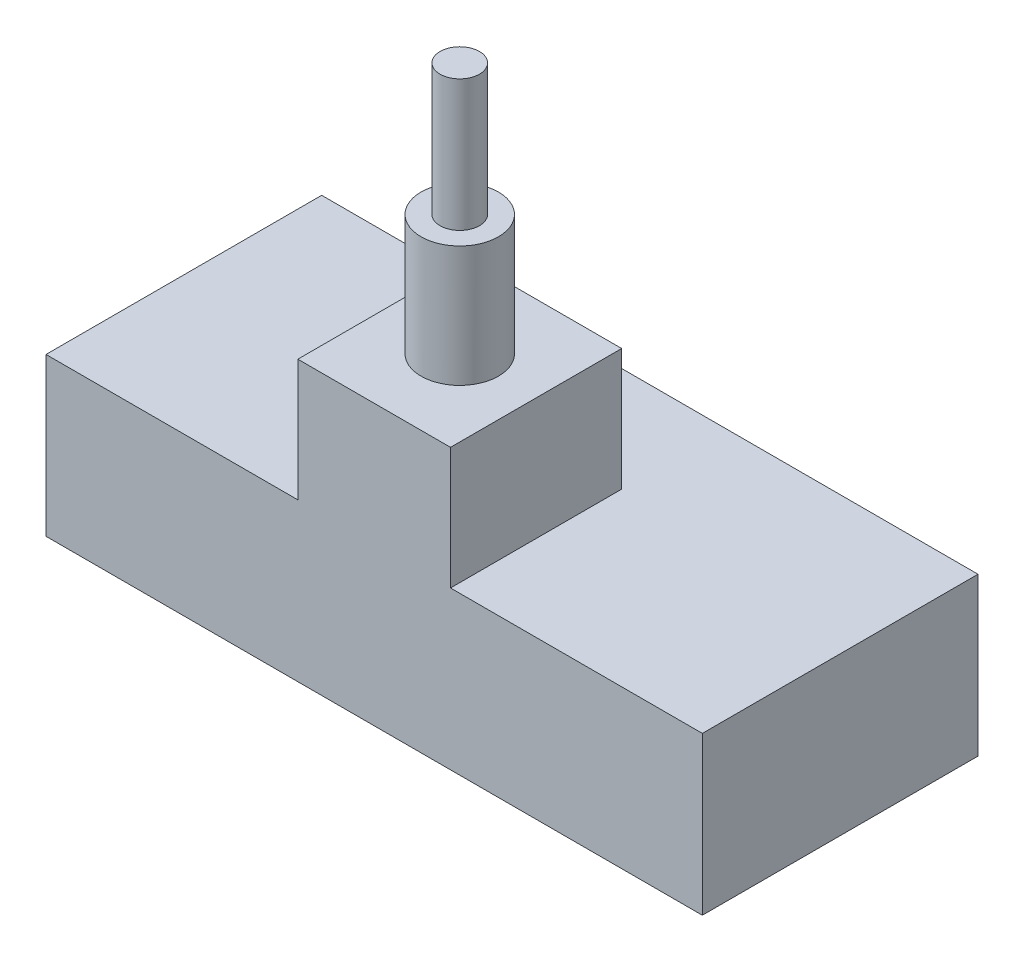
ISO-10303-21;
HEADER;
FILE_DESCRIPTION(('STEP AP214'),'2;1');
FILE_NAME('part.step','',(''),(''),'','','');
FILE_SCHEMA(('AUTOMOTIVE_DESIGN { 1 0 10303 214 1 1 1 1 }'));
ENDSEC;
DATA;
#1=APPLICATION_CONTEXT('core data for automotive mechanical design processes');
#2=APPLICATION_PROTOCOL_DEFINITION('international standard','automotive_design',2000,#1);
#3=PRODUCT_CONTEXT('',#1,'mechanical');
#4=PRODUCT('Part','Part','',(#3));
#5=PRODUCT_RELATED_PRODUCT_CATEGORY('part','',(#4));
#6=PRODUCT_DEFINITION_FORMATION('','',#4);
#7=PRODUCT_DEFINITION_CONTEXT('part definition',#1,'design');
#8=PRODUCT_DEFINITION('design','',#6,#7);
#9=PRODUCT_DEFINITION_SHAPE('','',#8);
#10=(LENGTH_UNIT() NAMED_UNIT(*) SI_UNIT(.MILLI.,.METRE.));
#11=(NAMED_UNIT(*) PLANE_ANGLE_UNIT() SI_UNIT($,.RADIAN.));
#12=(NAMED_UNIT(*) SI_UNIT($,.STERADIAN.) SOLID_ANGLE_UNIT());
#13=UNCERTAINTY_MEASURE_WITH_UNIT(LENGTH_MEASURE(1.E-05),#10,'distance_accuracy_value','');
#14=(GEOMETRIC_REPRESENTATION_CONTEXT(3) GLOBAL_UNCERTAINTY_ASSIGNED_CONTEXT((#13)) GLOBAL_UNIT_ASSIGNED_CONTEXT((#10,
#11,#12)) REPRESENTATION_CONTEXT('',''));
#15=CARTESIAN_POINT('',(0.,0.,0.));
#16=DIRECTION('',(0.,0.,1.));
#17=DIRECTION('',(1.,0.,0.));
#18=AXIS2_PLACEMENT_3D('',#15,#16,#17);
#19=CARTESIAN_POINT('',(5.815,9.28,6.52));
#20=DIRECTION('',(-1.,0.,0.));
#21=DIRECTION('',(0.,0.,1.));
#22=AXIS2_PLACEMENT_3D('',#19,#20,#21);
#23=PLANE('',#22);
#24=DIRECTION('',(0.,0.,-1.));
#25=VECTOR('',#24,1.);
#26=CARTESIAN_POINT('',(5.815,0.,6.52));
#27=LINE('',#26,#25);
#28=CARTESIAN_POINT('',(5.815,0.,6.52));
#29=VERTEX_POINT('',#28);
#30=CARTESIAN_POINT('',(5.815,0.,-6.52));
#31=VERTEX_POINT('',#30);
#32=EDGE_CURVE('E120',#29,#31,#27,.T.);
#33=ORIENTED_EDGE('',*,*,#32,.T.);
#34=DIRECTION('',(0.,-1.,0.));
#35=VECTOR('',#34,1.);
#36=CARTESIAN_POINT('',(5.815,9.28,-6.52));
#37=LINE('',#36,#35);
#38=CARTESIAN_POINT('',(5.815,9.28,-6.52));
#39=VERTEX_POINT('',#38);
#40=EDGE_CURVE('E43',#39,#31,#37,.T.);
#41=ORIENTED_EDGE('',*,*,#40,.F.);
#42=DIRECTION('',(0.,0.,-1.));
#43=VECTOR('',#42,1.);
#44=CARTESIAN_POINT('',(5.815,9.28,6.52));
#45=LINE('',#44,#43);
#46=CARTESIAN_POINT('',(5.815,9.28,6.52));
#47=VERTEX_POINT('',#46);
#48=EDGE_CURVE('E129',#47,#39,#45,.T.);
#49=ORIENTED_EDGE('',*,*,#48,.F.);
#50=DIRECTION('',(0.,-1.,0.));
#51=VECTOR('',#50,1.);
#52=CARTESIAN_POINT('',(5.815,9.28,6.52));
#53=LINE('',#52,#51);
#54=EDGE_CURVE('E136',#47,#29,#53,.T.);
#55=ORIENTED_EDGE('',*,*,#54,.T.);
#56=EDGE_LOOP('',(#33,#41,#49,#55));
#57=FACE_BOUND('',#56,.T.);
#58=ADVANCED_FACE('F35',(#57),#23,.F.);
#59=CARTESIAN_POINT('',(-5.815,9.28,-6.52));
#60=DIRECTION('',(0.,0.,1.));
#61=DIRECTION('',(1.,0.,0.));
#62=AXIS2_PLACEMENT_3D('',#59,#60,#61);
#63=PLANE('',#62);
#64=DIRECTION('',(-1.,0.,0.));
#65=VECTOR('',#64,1.);
#66=CARTESIAN_POINT('',(-5.815,0.,-6.52));
#67=LINE('',#66,#65);
#68=CARTESIAN_POINT('',(-5.815,0.,-6.52));
#69=VERTEX_POINT('',#68);
#70=EDGE_CURVE('E123',#31,#69,#67,.T.);
#71=ORIENTED_EDGE('',*,*,#70,.T.);
#72=DIRECTION('',(0.,-1.,0.));
#73=VECTOR('',#72,1.);
#74=CARTESIAN_POINT('',(-5.815,9.28,-6.52));
#75=LINE('',#74,#73);
#76=CARTESIAN_POINT('',(-5.815,9.28,-6.52));
#77=VERTEX_POINT('',#76);
#78=EDGE_CURVE('E147',#77,#69,#75,.T.);
#79=ORIENTED_EDGE('',*,*,#78,.F.);
#80=DIRECTION('',(-1.,0.,0.));
#81=VECTOR('',#80,1.);
#82=CARTESIAN_POINT('',(-5.815,9.28,-6.52));
#83=LINE('',#82,#81);
#84=EDGE_CURVE('E131',#39,#77,#83,.T.);
#85=ORIENTED_EDGE('',*,*,#84,.F.);
#86=ORIENTED_EDGE('',*,*,#40,.T.);
#87=EDGE_LOOP('',(#71,#79,#85,#86));
#88=FACE_BOUND('',#87,.T.);
#89=ADVANCED_FACE('F152',(#88),#63,.F.);
#90=CARTESIAN_POINT('',(-5.815,9.28,6.52));
#91=DIRECTION('',(1.,0.,0.));
#92=DIRECTION('',(0.,0.,-1.));
#93=AXIS2_PLACEMENT_3D('',#90,#91,#92);
#94=PLANE('',#93);
#95=DIRECTION('',(0.,0.,1.));
#96=VECTOR('',#95,1.);
#97=CARTESIAN_POINT('',(-5.815,0.,6.52));
#98=LINE('',#97,#96);
#99=CARTESIAN_POINT('',(-5.815,0.,6.52));
#100=VERTEX_POINT('',#99);
#101=EDGE_CURVE('E132',#69,#100,#98,.T.);
#102=ORIENTED_EDGE('',*,*,#101,.T.);
#103=DIRECTION('',(0.,-1.,0.));
#104=VECTOR('',#103,1.);
#105=CARTESIAN_POINT('',(-5.815,9.28,6.52));
#106=LINE('',#105,#104);
#107=CARTESIAN_POINT('',(-5.815,9.28,6.52));
#108=VERTEX_POINT('',#107);
#109=EDGE_CURVE('E144',#108,#100,#106,.T.);
#110=ORIENTED_EDGE('',*,*,#109,.F.);
#111=DIRECTION('',(0.,0.,1.));
#112=VECTOR('',#111,1.);
#113=CARTESIAN_POINT('',(-5.815,9.28,6.52));
#114=LINE('',#113,#112);
#115=EDGE_CURVE('E134',#77,#108,#114,.T.);
#116=ORIENTED_EDGE('',*,*,#115,.F.);
#117=ORIENTED_EDGE('',*,*,#78,.T.);
#118=EDGE_LOOP('',(#102,#110,#116,#117));
#119=FACE_BOUND('',#118,.T.);
#120=ADVANCED_FACE('F182',(#119),#94,.F.);
#121=CARTESIAN_POINT('',(-5.815,9.28,6.52));
#122=DIRECTION('',(0.,0.,-1.));
#123=DIRECTION('',(-1.,0.,0.));
#124=AXIS2_PLACEMENT_3D('',#121,#122,#123);
#125=PLANE('',#124);
#126=ORIENTED_EDGE('',*,*,#109,.T.);
#127=DIRECTION('',(-1.,0.,0.));
#128=VECTOR('',#127,1.);
#129=CARTESIAN_POINT('',(-25.,0.,6.52));
#130=LINE('',#129,#128);
#131=CARTESIAN_POINT('',(-25.,0.,6.52));
#132=VERTEX_POINT('',#131);
#133=EDGE_CURVE('E166',#100,#132,#130,.T.);
#134=ORIENTED_EDGE('',*,*,#133,.T.);
#135=DIRECTION('',(0.,1.,0.));
#136=VECTOR('',#135,1.);
#137=CARTESIAN_POINT('',(-25.,-12.,6.52));
#138=LINE('',#137,#136);
#139=CARTESIAN_POINT('',(-25.,-12.,6.52));
#140=VERTEX_POINT('',#139);
#141=EDGE_CURVE('E172',#140,#132,#138,.T.);
#142=ORIENTED_EDGE('',*,*,#141,.F.);
#143=DIRECTION('',(-1.,0.,0.));
#144=VECTOR('',#143,1.);
#145=CARTESIAN_POINT('',(-25.,-12.,6.52));
#146=LINE('',#145,#144);
#147=CARTESIAN_POINT('',(25.,-12.,6.52));
#148=VERTEX_POINT('',#147);
#149=EDGE_CURVE('E111',#148,#140,#146,.T.);
#150=ORIENTED_EDGE('',*,*,#149,.F.);
#151=DIRECTION('',(0.,1.,0.));
#152=VECTOR('',#151,1.);
#153=CARTESIAN_POINT('',(25.,-12.,6.52));
#154=LINE('',#153,#152);
#155=CARTESIAN_POINT('',(25.,0.,6.52));
#156=VERTEX_POINT('',#155);
#157=EDGE_CURVE('E125',#148,#156,#154,.T.);
#158=ORIENTED_EDGE('',*,*,#157,.T.);
#159=EDGE_CURVE('E115',#156,#29,#130,.T.);
#160=ORIENTED_EDGE('',*,*,#159,.T.);
#161=ORIENTED_EDGE('',*,*,#54,.F.);
#162=DIRECTION('',(1.,0.,0.));
#163=VECTOR('',#162,1.);
#164=CARTESIAN_POINT('',(-5.815,9.28,6.52));
#165=LINE('',#164,#163);
#166=EDGE_CURVE('E50',#108,#47,#165,.T.);
#167=ORIENTED_EDGE('',*,*,#166,.F.);
#168=EDGE_LOOP('',(#126,#134,#142,#150,#158,#160,#161,#167));
#169=FACE_BOUND('',#168,.T.);
#170=ADVANCED_FACE('F164',(#169),#125,.F.);
#171=CARTESIAN_POINT('',(0.,9.28,0.));
#172=DIRECTION('',(0.,-1.,0.));
#173=DIRECTION('',(0.,0.,-1.));
#174=AXIS2_PLACEMENT_3D('',#171,#172,#173);
#175=PLANE('',#174);
#176=CARTESIAN_POINT('',(0.,9.28,0.));
#177=DIRECTION('',(0.,-1.,0.));
#178=DIRECTION('',(0.,0.,-1.));
#179=AXIS2_PLACEMENT_3D('',#176,#177,#178);
#180=CIRCLE('',#179,2.95);
#181=CARTESIAN_POINT('',(0.,9.28,-2.95));
#182=VERTEX_POINT('',#181);
#183=EDGE_CURVE('E11',#182,#182,#180,.F.);
#184=ORIENTED_EDGE('',*,*,#183,.F.);
#185=EDGE_LOOP('',(#184));
#186=FACE_BOUND('',#185,.T.);
#187=ORIENTED_EDGE('',*,*,#48,.T.);
#188=ORIENTED_EDGE('',*,*,#84,.T.);
#189=ORIENTED_EDGE('',*,*,#115,.T.);
#190=ORIENTED_EDGE('',*,*,#166,.T.);
#191=EDGE_LOOP('',(#187,#188,#189,#190));
#192=FACE_BOUND('',#191,.T.);
#193=ADVANCED_FACE('F184',(#186,#192),#175,.F.);
#194=CARTESIAN_POINT('',(-25.,-12.,6.52));
#195=DIRECTION('',(1.,0.,0.));
#196=DIRECTION('',(0.,0.,-1.));
#197=AXIS2_PLACEMENT_3D('',#194,#195,#196);
#198=PLANE('',#197);
#199=DIRECTION('',(0.,0.,-1.));
#200=VECTOR('',#199,1.);
#201=CARTESIAN_POINT('',(-25.,0.,6.52));
#202=LINE('',#201,#200);
#203=CARTESIAN_POINT('',(-25.,0.,-14.48));
#204=VERTEX_POINT('',#203);
#205=EDGE_CURVE('E119',#132,#204,#202,.T.);
#206=ORIENTED_EDGE('',*,*,#205,.T.);
#207=DIRECTION('',(0.,1.,0.));
#208=VECTOR('',#207,1.);
#209=CARTESIAN_POINT('',(-25.,-12.,-14.48));
#210=LINE('',#209,#208);
#211=CARTESIAN_POINT('',(-25.,-12.,-14.48));
#212=VERTEX_POINT('',#211);
#213=EDGE_CURVE('E99',#212,#204,#210,.T.);
#214=ORIENTED_EDGE('',*,*,#213,.F.);
#215=DIRECTION('',(0.,0.,-1.));
#216=VECTOR('',#215,1.);
#217=CARTESIAN_POINT('',(-25.,-12.,6.52));
#218=LINE('',#217,#216);
#219=EDGE_CURVE('E106',#140,#212,#218,.T.);
#220=ORIENTED_EDGE('',*,*,#219,.F.);
#221=ORIENTED_EDGE('',*,*,#141,.T.);
#222=EDGE_LOOP('',(#206,#214,#220,#221));
#223=FACE_BOUND('',#222,.T.);
#224=ADVANCED_FACE('F117',(#223),#198,.F.);
#225=CARTESIAN_POINT('',(-25.,-12.,-14.48));
#226=DIRECTION('',(0.,0.,1.));
#227=DIRECTION('',(1.,0.,0.));
#228=AXIS2_PLACEMENT_3D('',#225,#226,#227);
#229=PLANE('',#228);
#230=DIRECTION('',(1.,0.,0.));
#231=VECTOR('',#230,1.);
#232=CARTESIAN_POINT('',(-25.,0.,-14.48));
#233=LINE('',#232,#231);
#234=CARTESIAN_POINT('',(25.,0.,-14.48));
#235=VERTEX_POINT('',#234);
#236=EDGE_CURVE('E176',#204,#235,#233,.T.);
#237=ORIENTED_EDGE('',*,*,#236,.T.);
#238=DIRECTION('',(0.,1.,0.));
#239=VECTOR('',#238,1.);
#240=CARTESIAN_POINT('',(25.,-12.,-14.48));
#241=LINE('',#240,#239);
#242=CARTESIAN_POINT('',(25.,-12.,-14.48));
#243=VERTEX_POINT('',#242);
#244=EDGE_CURVE('E102',#243,#235,#241,.T.);
#245=ORIENTED_EDGE('',*,*,#244,.F.);
#246=DIRECTION('',(1.,0.,0.));
#247=VECTOR('',#246,1.);
#248=CARTESIAN_POINT('',(-25.,-12.,-14.48));
#249=LINE('',#248,#247);
#250=EDGE_CURVE('E95',#212,#243,#249,.T.);
#251=ORIENTED_EDGE('',*,*,#250,.F.);
#252=ORIENTED_EDGE('',*,*,#213,.T.);
#253=EDGE_LOOP('',(#237,#245,#251,#252));
#254=FACE_BOUND('',#253,.T.);
#255=ADVANCED_FACE('F97',(#254),#229,.F.);
#256=CARTESIAN_POINT('',(25.,-12.,6.52));
#257=DIRECTION('',(-1.,0.,0.));
#258=DIRECTION('',(0.,0.,1.));
#259=AXIS2_PLACEMENT_3D('',#256,#257,#258);
#260=PLANE('',#259);
#261=DIRECTION('',(0.,0.,1.));
#262=VECTOR('',#261,1.);
#263=CARTESIAN_POINT('',(25.,0.,6.52));
#264=LINE('',#263,#262);
#265=EDGE_CURVE('E168',#235,#156,#264,.T.);
#266=ORIENTED_EDGE('',*,*,#265,.T.);
#267=ORIENTED_EDGE('',*,*,#157,.F.);
#268=DIRECTION('',(0.,0.,1.));
#269=VECTOR('',#268,1.);
#270=CARTESIAN_POINT('',(25.,-12.,6.52));
#271=LINE('',#270,#269);
#272=EDGE_CURVE('E105',#243,#148,#271,.T.);
#273=ORIENTED_EDGE('',*,*,#272,.F.);
#274=ORIENTED_EDGE('',*,*,#244,.T.);
#275=EDGE_LOOP('',(#266,#267,#273,#274));
#276=FACE_BOUND('',#275,.T.);
#277=ADVANCED_FACE('F179',(#276),#260,.F.);
#278=CARTESIAN_POINT('',(0.,-12.,0.));
#279=DIRECTION('',(0.,-1.,0.));
#280=DIRECTION('',(0.,0.,-1.));
#281=AXIS2_PLACEMENT_3D('',#278,#279,#280);
#282=PLANE('',#281);
#283=ORIENTED_EDGE('',*,*,#219,.T.);
#284=ORIENTED_EDGE('',*,*,#250,.T.);
#285=ORIENTED_EDGE('',*,*,#272,.T.);
#286=ORIENTED_EDGE('',*,*,#149,.T.);
#287=EDGE_LOOP('',(#283,#284,#285,#286));
#288=FACE_BOUND('',#287,.T.);
#289=ADVANCED_FACE('F109',(#288),#282,.T.);
#290=CARTESIAN_POINT('',(0.,0.,0.));
#291=DIRECTION('',(0.,-1.,0.));
#292=DIRECTION('',(0.,0.,-1.));
#293=AXIS2_PLACEMENT_3D('',#290,#291,#292);
#294=PLANE('',#293);
#295=ORIENTED_EDGE('',*,*,#32,.F.);
#296=ORIENTED_EDGE('',*,*,#159,.F.);
#297=ORIENTED_EDGE('',*,*,#265,.F.);
#298=ORIENTED_EDGE('',*,*,#236,.F.);
#299=ORIENTED_EDGE('',*,*,#205,.F.);
#300=ORIENTED_EDGE('',*,*,#133,.F.);
#301=ORIENTED_EDGE('',*,*,#101,.F.);
#302=ORIENTED_EDGE('',*,*,#70,.F.);
#303=EDGE_LOOP('',(#295,#296,#297,#298,#299,#300,#301,#302));
#304=FACE_BOUND('',#303,.T.);
#305=ADVANCED_FACE('F159',(#304),#294,.F.);
#306=CARTESIAN_POINT('',(0.,18.48,0.));
#307=DIRECTION('',(0.,-1.,0.));
#308=DIRECTION('',(0.,0.,-1.));
#309=AXIS2_PLACEMENT_3D('',#306,#307,#308);
#310=CYLINDRICAL_SURFACE('',#309,2.95);
#311=CARTESIAN_POINT('',(0.,18.48,0.));
#312=DIRECTION('',(0.,1.,0.));
#313=DIRECTION('',(0.,0.,1.));
#314=AXIS2_PLACEMENT_3D('',#311,#312,#313);
#315=CIRCLE('',#314,2.95);
#316=CARTESIAN_POINT('',(0.,18.48,2.95));
#317=VERTEX_POINT('',#316);
#318=EDGE_CURVE('E177',#317,#317,#315,.T.);
#319=ORIENTED_EDGE('',*,*,#318,.F.);
#320=EDGE_LOOP('',(#319));
#321=FACE_BOUND('',#320,.T.);
#322=ORIENTED_EDGE('',*,*,#183,.T.);
#323=EDGE_LOOP('',(#322));
#324=FACE_BOUND('',#323,.T.);
#325=ADVANCED_FACE('F220',(#321,#324),#310,.T.);
#326=CARTESIAN_POINT('',(0.,18.48,0.));
#327=DIRECTION('',(0.,1.,0.));
#328=DIRECTION('',(0.,0.,1.));
#329=AXIS2_PLACEMENT_3D('',#326,#327,#328);
#330=PLANE('',#329);
#331=CARTESIAN_POINT('',(0.,18.48,0.));
#332=DIRECTION('',(0.,1.,0.));
#333=DIRECTION('',(0.,0.,1.));
#334=AXIS2_PLACEMENT_3D('',#331,#332,#333);
#335=CIRCLE('',#334,1.5);
#336=CARTESIAN_POINT('',(0.,18.48,1.5));
#337=VERTEX_POINT('',#336);
#338=EDGE_CURVE('E339',#337,#337,#335,.T.);
#339=ORIENTED_EDGE('',*,*,#338,.F.);
#340=EDGE_LOOP('',(#339));
#341=FACE_BOUND('',#340,.T.);
#342=ORIENTED_EDGE('',*,*,#318,.T.);
#343=EDGE_LOOP('',(#342));
#344=FACE_BOUND('',#343,.T.);
#345=ADVANCED_FACE('F224',(#341,#344),#330,.T.);
#346=CARTESIAN_POINT('',(0.,28.48,0.));
#347=DIRECTION('',(0.,-1.,0.));
#348=DIRECTION('',(0.,0.,-1.));
#349=AXIS2_PLACEMENT_3D('',#346,#347,#348);
#350=CYLINDRICAL_SURFACE('',#349,1.5);
#351=CARTESIAN_POINT('',(0.,28.48,0.));
#352=DIRECTION('',(0.,1.,0.));
#353=DIRECTION('',(0.,0.,1.));
#354=AXIS2_PLACEMENT_3D('',#351,#352,#353);
#355=CIRCLE('',#354,1.5);
#356=CARTESIAN_POINT('',(0.,28.48,1.5));
#357=VERTEX_POINT('',#356);
#358=EDGE_CURVE('E342',#357,#357,#355,.T.);
#359=ORIENTED_EDGE('',*,*,#358,.F.);
#360=EDGE_LOOP('',(#359));
#361=FACE_BOUND('',#360,.T.);
#362=ORIENTED_EDGE('',*,*,#338,.T.);
#363=EDGE_LOOP('',(#362));
#364=FACE_BOUND('',#363,.T.);
#365=ADVANCED_FACE('F239',(#361,#364),#350,.T.);
#366=CARTESIAN_POINT('',(0.,28.48,0.));
#367=DIRECTION('',(0.,1.,0.));
#368=DIRECTION('',(0.,0.,1.));
#369=AXIS2_PLACEMENT_3D('',#366,#367,#368);
#370=PLANE('',#369);
#371=ORIENTED_EDGE('',*,*,#358,.T.);
#372=EDGE_LOOP('',(#371));
#373=FACE_BOUND('',#372,.T.);
#374=ADVANCED_FACE('F244',(#373),#370,.T.);
#375=CLOSED_SHELL('',(#58,#89,#120,#170,#193,#224,#255,#277,#289,#305,#325,#345,#365,#374));
#376=MANIFOLD_SOLID_BREP('B2',#375);
#377=ADVANCED_BREP_SHAPE_REPRESENTATION('',(#18,#376),#14);
#378=SHAPE_DEFINITION_REPRESENTATION(#9,#377);
ENDSEC;
END-ISO-10303-21;
